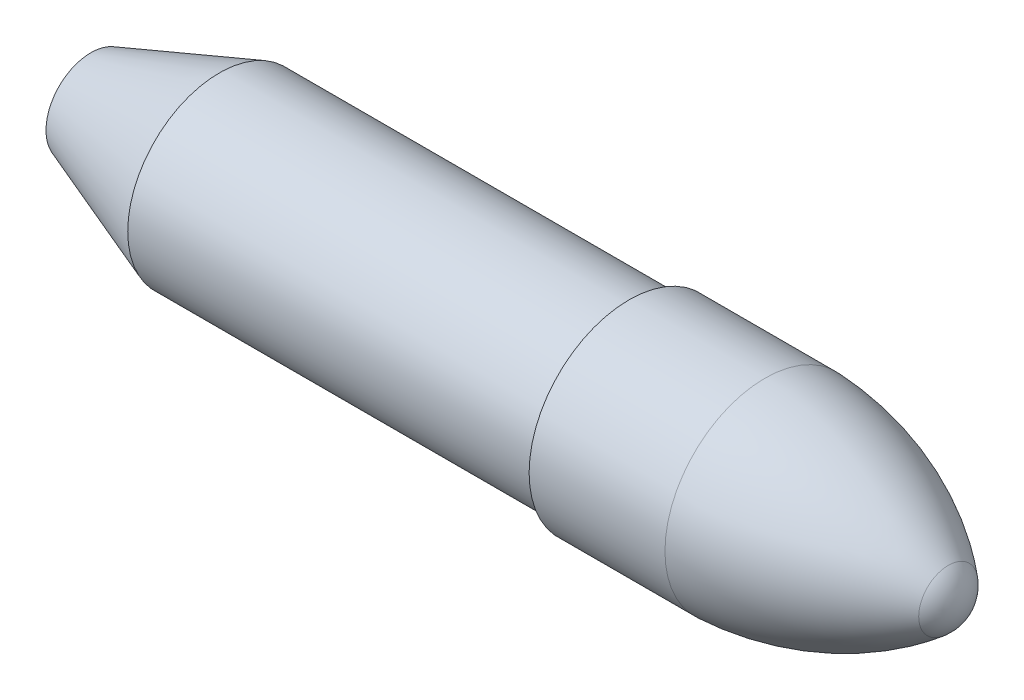
ISO-10303-21;
HEADER;
FILE_DESCRIPTION(('STEP AP214'),'2;1');
FILE_NAME('part.step','',(''),(''),'','','');
FILE_SCHEMA(('AUTOMOTIVE_DESIGN { 1 0 10303 214 1 1 1 1 }'));
ENDSEC;
DATA;
#1=APPLICATION_CONTEXT('core data for automotive mechanical design processes');
#2=APPLICATION_PROTOCOL_DEFINITION('international standard','automotive_design',2000,#1);
#3=PRODUCT_CONTEXT('',#1,'mechanical');
#4=PRODUCT('Part','Part','',(#3));
#5=PRODUCT_RELATED_PRODUCT_CATEGORY('part','',(#4));
#6=PRODUCT_DEFINITION_FORMATION('','',#4);
#7=PRODUCT_DEFINITION_CONTEXT('part definition',#1,'design');
#8=PRODUCT_DEFINITION('design','',#6,#7);
#9=PRODUCT_DEFINITION_SHAPE('','',#8);
#10=(LENGTH_UNIT() NAMED_UNIT(*) SI_UNIT(.MILLI.,.METRE.));
#11=(NAMED_UNIT(*) PLANE_ANGLE_UNIT() SI_UNIT($,.RADIAN.));
#12=(NAMED_UNIT(*) SI_UNIT($,.STERADIAN.) SOLID_ANGLE_UNIT());
#13=UNCERTAINTY_MEASURE_WITH_UNIT(LENGTH_MEASURE(1.E-05),#10,'distance_accuracy_value','');
#14=(GEOMETRIC_REPRESENTATION_CONTEXT(3) GLOBAL_UNCERTAINTY_ASSIGNED_CONTEXT((#13)) GLOBAL_UNIT_ASSIGNED_CONTEXT((#10,
#11,#12)) REPRESENTATION_CONTEXT('',''));
#15=CARTESIAN_POINT('',(0.,0.,0.));
#16=DIRECTION('',(0.,0.,1.));
#17=DIRECTION('',(1.,0.,0.));
#18=AXIS2_PLACEMENT_3D('',#15,#16,#17);
#19=CARTESIAN_POINT('',(0.,0.,0.));
#20=DIRECTION('',(1.,0.,0.));
#21=DIRECTION('',(0.,0.,-1.));
#22=AXIS2_PLACEMENT_3D('',#19,#20,#21);
#23=PLANE('',#22);
#24=CARTESIAN_POINT('',(0.,0.,0.));
#25=DIRECTION('',(-1.,0.,0.));
#26=DIRECTION('',(0.,0.,1.));
#27=AXIS2_PLACEMENT_3D('',#24,#25,#26);
#28=CIRCLE('',#27,1.75);
#29=CARTESIAN_POINT('',(0.,0.,1.75));
#30=VERTEX_POINT('',#29);
#31=EDGE_CURVE('E10',#30,#30,#28,.T.);
#32=ORIENTED_EDGE('',*,*,#31,.T.);
#33=EDGE_LOOP('',(#32));
#34=FACE_BOUND('',#33,.T.);
#35=ADVANCED_FACE('F30',(#34),#23,.F.);
#36=CARTESIAN_POINT('',(5.01414629050467,0.,0.));
#37=DIRECTION('',(1.,0.,0.));
#38=DIRECTION('',(0.,0.,-1.));
#39=AXIS2_PLACEMENT_3D('',#36,#37,#38);
#40=CONICAL_SURFACE('',#39,3.575,0.349065850398867);
#41=ORIENTED_EDGE('',*,*,#31,.F.);
#42=EDGE_LOOP('',(#41));
#43=FACE_BOUND('',#42,.T.);
#44=CARTESIAN_POINT('',(5.01414629050467,0.,0.));
#45=DIRECTION('',(-1.,0.,0.));
#46=DIRECTION('',(0.,0.,1.));
#47=AXIS2_PLACEMENT_3D('',#44,#45,#46);
#48=CIRCLE('',#47,3.575);
#49=CARTESIAN_POINT('',(5.01414629050467,0.,3.575));
#50=VERTEX_POINT('',#49);
#51=EDGE_CURVE('E36',#50,#50,#48,.T.);
#52=ORIENTED_EDGE('',*,*,#51,.T.);
#53=EDGE_LOOP('',(#52));
#54=FACE_BOUND('',#53,.T.);
#55=ADVANCED_FACE('F68',(#43,#54),#40,.T.);
#56=CARTESIAN_POINT('',(0.,0.,0.));
#57=DIRECTION('',(-1.,0.,0.));
#58=DIRECTION('',(0.,0.,1.));
#59=AXIS2_PLACEMENT_3D('',#56,#57,#58);
#60=CYLINDRICAL_SURFACE('',#59,3.575);
#61=ORIENTED_EDGE('',*,*,#51,.F.);
#62=EDGE_LOOP('',(#61));
#63=FACE_BOUND('',#62,.T.);
#64=CARTESIAN_POINT('',(21.,0.,0.));
#65=DIRECTION('',(-1.,0.,0.));
#66=DIRECTION('',(0.,0.,1.));
#67=AXIS2_PLACEMENT_3D('',#64,#65,#66);
#68=CIRCLE('',#67,3.575);
#69=CARTESIAN_POINT('',(21.,0.,3.575));
#70=VERTEX_POINT('',#69);
#71=EDGE_CURVE('E40',#70,#70,#68,.T.);
#72=ORIENTED_EDGE('',*,*,#71,.T.);
#73=EDGE_LOOP('',(#72));
#74=FACE_BOUND('',#73,.T.);
#75=ADVANCED_FACE('F72',(#63,#74),#60,.T.);
#76=CARTESIAN_POINT('',(21.,3.575,0.));
#77=DIRECTION('',(1.,0.,0.));
#78=DIRECTION('',(0.,0.,-1.));
#79=AXIS2_PLACEMENT_3D('',#76,#77,#78);
#80=PLANE('',#79);
#81=ORIENTED_EDGE('',*,*,#71,.F.);
#82=EDGE_LOOP('',(#81));
#83=FACE_BOUND('',#82,.T.);
#84=CARTESIAN_POINT('',(21.,0.,0.));
#85=DIRECTION('',(-1.,0.,0.));
#86=DIRECTION('',(0.,0.,1.));
#87=AXIS2_PLACEMENT_3D('',#84,#85,#86);
#88=CIRCLE('',#87,3.9);
#89=CARTESIAN_POINT('',(21.,0.,3.9));
#90=VERTEX_POINT('',#89);
#91=EDGE_CURVE('E44',#90,#90,#88,.T.);
#92=ORIENTED_EDGE('',*,*,#91,.T.);
#93=EDGE_LOOP('',(#92));
#94=FACE_BOUND('',#93,.T.);
#95=ADVANCED_FACE('F77',(#83,#94),#80,.F.);
#96=CARTESIAN_POINT('',(0.,0.,0.));
#97=DIRECTION('',(-1.,0.,0.));
#98=DIRECTION('',(0.,0.,1.));
#99=AXIS2_PLACEMENT_3D('',#96,#97,#98);
#100=CYLINDRICAL_SURFACE('',#99,3.9);
#101=ORIENTED_EDGE('',*,*,#91,.F.);
#102=EDGE_LOOP('',(#101));
#103=FACE_BOUND('',#102,.T.);
#104=CARTESIAN_POINT('',(26.3,0.,0.));
#105=DIRECTION('',(-1.,0.,0.));
#106=DIRECTION('',(0.,0.,1.));
#107=AXIS2_PLACEMENT_3D('',#104,#105,#106);
#108=CIRCLE('',#107,3.9);
#109=CARTESIAN_POINT('',(26.3,0.,3.9));
#110=VERTEX_POINT('',#109);
#111=EDGE_CURVE('E49',#110,#110,#108,.T.);
#112=ORIENTED_EDGE('',*,*,#111,.T.);
#113=EDGE_LOOP('',(#112));
#114=FACE_BOUND('',#113,.T.);
#115=ADVANCED_FACE('F64',(#103,#114),#100,.T.);
#116=CARTESIAN_POINT('',(25.8063887457933,0.,0.));
#117=DIRECTION('',(-1.,0.,0.));
#118=DIRECTION('',(0.,0.,1.));
#119=AXIS2_PLACEMENT_3D('',#116,#117,#118);
#120=DEGENERATE_TOROIDAL_SURFACE('',#119,8.08984353232854,12.,.F.);
#121=ORIENTED_EDGE('',*,*,#111,.F.);
#122=EDGE_LOOP('',(#121));
#123=FACE_BOUND('',#122,.T.);
#124=CARTESIAN_POINT('',(33.4562301791724,0.,0.));
#125=DIRECTION('',(-1.,0.,0.));
#126=DIRECTION('',(0.,0.,1.));
#127=AXIS2_PLACEMENT_3D('',#124,#125,#126);
#128=CIRCLE('',#127,1.15569193318979);
#129=CARTESIAN_POINT('',(33.4562301791724,0.,1.15569193318979));
#130=VERTEX_POINT('',#129);
#131=EDGE_CURVE('E52',#130,#130,#128,.T.);
#132=ORIENTED_EDGE('',*,*,#131,.T.);
#133=EDGE_LOOP('',(#132));
#134=FACE_BOUND('',#133,.T.);
#135=ADVANCED_FACE('F56',(#123,#134),#120,.F.);
#136=CARTESIAN_POINT('',(32.5,0.,0.));
#137=DIRECTION('',(-1.,0.,0.));
#138=DIRECTION('',(0.,1.,0.));
#139=AXIS2_PLACEMENT_3D('',#136,#137,#138);
#140=SPHERICAL_SURFACE('',#139,1.5);
#141=ORIENTED_EDGE('',*,*,#131,.F.);
#142=EDGE_LOOP('',(#141));
#143=FACE_BOUND('',#142,.T.);
#144=ADVANCED_FACE('F58',(#143),#140,.T.);
#145=CLOSED_SHELL('',(#35,#55,#75,#95,#115,#135,#144));
#146=MANIFOLD_SOLID_BREP('B2',#145);
#147=ADVANCED_BREP_SHAPE_REPRESENTATION('',(#18,#146),#14);
#148=SHAPE_DEFINITION_REPRESENTATION(#9,#147);
ENDSEC;
END-ISO-10303-21;
